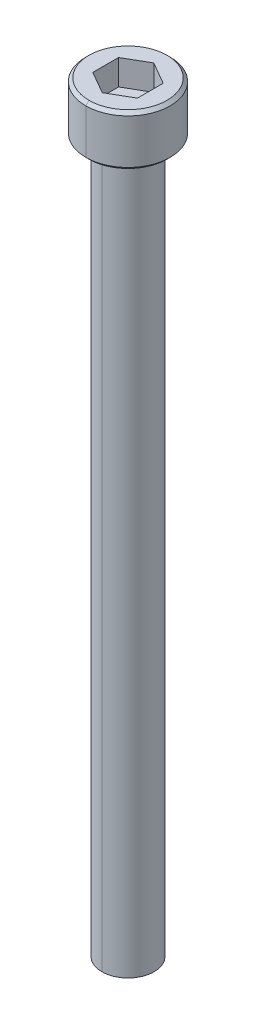
ISO-10303-21;
HEADER;
FILE_DESCRIPTION(('STEP AP214'),'2;1');
FILE_NAME('part.step','',(''),(''),'','','');
FILE_SCHEMA(('AUTOMOTIVE_DESIGN { 1 0 10303 214 1 1 1 1 }'));
ENDSEC;
DATA;
#1=APPLICATION_CONTEXT('core data for automotive mechanical design processes');
#2=APPLICATION_PROTOCOL_DEFINITION('international standard','automotive_design',2000,#1);
#3=PRODUCT_CONTEXT('',#1,'mechanical');
#4=PRODUCT('Part','Part','',(#3));
#5=PRODUCT_RELATED_PRODUCT_CATEGORY('part','',(#4));
#6=PRODUCT_DEFINITION_FORMATION('','',#4);
#7=PRODUCT_DEFINITION_CONTEXT('part definition',#1,'design');
#8=PRODUCT_DEFINITION('design','',#6,#7);
#9=PRODUCT_DEFINITION_SHAPE('','',#8);
#10=(LENGTH_UNIT() NAMED_UNIT(*) SI_UNIT(.MILLI.,.METRE.));
#11=(NAMED_UNIT(*) PLANE_ANGLE_UNIT() SI_UNIT($,.RADIAN.));
#12=(NAMED_UNIT(*) SI_UNIT($,.STERADIAN.) SOLID_ANGLE_UNIT());
#13=UNCERTAINTY_MEASURE_WITH_UNIT(LENGTH_MEASURE(1.E-05),#10,'distance_accuracy_value','');
#14=(GEOMETRIC_REPRESENTATION_CONTEXT(3) GLOBAL_UNCERTAINTY_ASSIGNED_CONTEXT((#13)) GLOBAL_UNIT_ASSIGNED_CONTEXT((#10,
#11,#12)) REPRESENTATION_CONTEXT('',''));
#15=CARTESIAN_POINT('',(0.,0.,0.));
#16=DIRECTION('',(0.,0.,1.));
#17=DIRECTION('',(1.,0.,0.));
#18=AXIS2_PLACEMENT_3D('',#15,#16,#17);
#19=CARTESIAN_POINT('',(0.,-56.61152,0.));
#20=DIRECTION('',(0.,1.,0.));
#21=DIRECTION('',(0.,0.,1.));
#22=AXIS2_PLACEMENT_3D('',#19,#20,#21);
#23=CONICAL_SURFACE('',#22,2.0828,0.960291895410483);
#24=DIRECTION('',(0.,0.573280843383967,-0.819358941251615));
#25=VECTOR('',#24,1.);
#26=CARTESIAN_POINT('',(0.,-56.61152,-2.0828));
#27=LINE('',#26,#25);
#28=CARTESIAN_POINT('',(0.,-57.15,-1.31318));
#29=VERTEX_POINT('',#28);
#30=CARTESIAN_POINT('',(0.,-56.61152,-2.0828));
#31=VERTEX_POINT('',#30);
#32=EDGE_CURVE('E189',#29,#31,#27,.T.);
#33=ORIENTED_EDGE('',*,*,#32,.F.);
#34=CARTESIAN_POINT('',(0.,-57.15,0.));
#35=DIRECTION('',(0.,-1.,0.));
#36=DIRECTION('',(0.,0.,1.));
#37=AXIS2_PLACEMENT_3D('',#34,#35,#36);
#38=CIRCLE('',#37,1.31318);
#39=CARTESIAN_POINT('',(0.,-57.15,1.31318));
#40=VERTEX_POINT('',#39);
#41=EDGE_CURVE('E207',#40,#29,#38,.T.);
#42=ORIENTED_EDGE('',*,*,#41,.F.);
#43=DIRECTION('',(0.,0.573280843383967,0.819358941251615));
#44=VECTOR('',#43,1.);
#45=CARTESIAN_POINT('',(0.,-56.61152,2.0828));
#46=LINE('',#45,#44);
#47=CARTESIAN_POINT('',(0.,-56.61152,2.0828));
#48=VERTEX_POINT('',#47);
#49=EDGE_CURVE('E188',#40,#48,#46,.T.);
#50=ORIENTED_EDGE('',*,*,#49,.T.);
#51=CARTESIAN_POINT('',(0.,-56.61152,0.));
#52=DIRECTION('',(0.,1.,0.));
#53=DIRECTION('',(0.,0.,1.));
#54=AXIS2_PLACEMENT_3D('',#51,#52,#53);
#55=CIRCLE('',#54,2.0828);
#56=EDGE_CURVE('E158',#31,#48,#55,.T.);
#57=ORIENTED_EDGE('',*,*,#56,.F.);
#58=EDGE_LOOP('',(#33,#42,#50,#57));
#59=FACE_BOUND('',#58,.T.);
#60=ADVANCED_FACE('F16',(#59),#23,.T.);
#61=CARTESIAN_POINT('',(0.,0.254,0.));
#62=DIRECTION('',(0.,1.,0.));
#63=DIRECTION('',(0.,0.,1.));
#64=AXIS2_PLACEMENT_3D('',#61,#62,#63);
#65=CONICAL_SURFACE('',#64,3.3655,0.785398163397444);
#66=DIRECTION('',(0.,0.707106781186551,-0.707106781186545));
#67=VECTOR('',#66,1.);
#68=CARTESIAN_POINT('',(0.,0.254,-3.3655));
#69=LINE('',#68,#67);
#70=CARTESIAN_POINT('',(0.,0.,-3.1115));
#71=VERTEX_POINT('',#70);
#72=CARTESIAN_POINT('',(0.,0.254,-3.3655));
#73=VERTEX_POINT('',#72);
#74=EDGE_CURVE('E221',#71,#73,#69,.T.);
#75=ORIENTED_EDGE('',*,*,#74,.F.);
#76=CARTESIAN_POINT('',(0.,0.,0.));
#77=DIRECTION('',(0.,-1.,0.));
#78=DIRECTION('',(0.,0.,1.));
#79=AXIS2_PLACEMENT_3D('',#76,#77,#78);
#80=CIRCLE('',#79,3.1115);
#81=CARTESIAN_POINT('',(0.,0.,3.1115));
#82=VERTEX_POINT('',#81);
#83=EDGE_CURVE('E149',#82,#71,#80,.T.);
#84=ORIENTED_EDGE('',*,*,#83,.F.);
#85=DIRECTION('',(0.,0.707106781186551,0.707106781186545));
#86=VECTOR('',#85,1.);
#87=CARTESIAN_POINT('',(0.,0.254,3.3655));
#88=LINE('',#87,#86);
#89=CARTESIAN_POINT('',(0.,0.254,3.3655));
#90=VERTEX_POINT('',#89);
#91=EDGE_CURVE('E168',#82,#90,#88,.T.);
#92=ORIENTED_EDGE('',*,*,#91,.T.);
#93=CARTESIAN_POINT('',(0.,0.254,0.));
#94=DIRECTION('',(0.,1.,0.));
#95=DIRECTION('',(0.,0.,1.));
#96=AXIS2_PLACEMENT_3D('',#93,#94,#95);
#97=CIRCLE('',#96,3.3655);
#98=EDGE_CURVE('E167',#73,#90,#97,.T.);
#99=ORIENTED_EDGE('',*,*,#98,.F.);
#100=EDGE_LOOP('',(#75,#84,#92,#99));
#101=FACE_BOUND('',#100,.T.);
#102=ADVANCED_FACE('F324',(#101),#65,.T.);
#103=CARTESIAN_POINT('',(0.,4.064,0.));
#104=DIRECTION('',(0.,-1.,0.));
#105=DIRECTION('',(0.,0.,-1.));
#106=AXIS2_PLACEMENT_3D('',#103,#104,#105);
#107=CONICAL_SURFACE('',#106,3.1115,0.785398163397439);
#108=DIRECTION('',(0.,-0.707106781186554,0.707106781186541));
#109=VECTOR('',#108,1.);
#110=CARTESIAN_POINT('',(0.,4.064,3.1115));
#111=LINE('',#110,#109);
#112=CARTESIAN_POINT('',(0.,4.064,3.1115));
#113=VERTEX_POINT('',#112);
#114=CARTESIAN_POINT('',(0.,3.81,3.3655));
#115=VERTEX_POINT('',#114);
#116=EDGE_CURVE('E177',#113,#115,#111,.T.);
#117=ORIENTED_EDGE('',*,*,#116,.F.);
#118=CARTESIAN_POINT('',(0.,4.064,0.));
#119=DIRECTION('',(0.,1.,0.));
#120=DIRECTION('',(0.,0.,1.));
#121=AXIS2_PLACEMENT_3D('',#118,#119,#120);
#122=CIRCLE('',#121,3.1115);
#123=CARTESIAN_POINT('',(0.,4.064,-3.1115));
#124=VERTEX_POINT('',#123);
#125=EDGE_CURVE('E163',#124,#113,#122,.T.);
#126=ORIENTED_EDGE('',*,*,#125,.F.);
#127=DIRECTION('',(0.,-0.707106781186554,-0.707106781186541));
#128=VECTOR('',#127,1.);
#129=CARTESIAN_POINT('',(0.,4.064,-3.1115));
#130=LINE('',#129,#128);
#131=CARTESIAN_POINT('',(0.,3.81,-3.3655));
#132=VERTEX_POINT('',#131);
#133=EDGE_CURVE('E190',#124,#132,#130,.T.);
#134=ORIENTED_EDGE('',*,*,#133,.T.);
#135=CARTESIAN_POINT('',(0.,3.81,0.));
#136=DIRECTION('',(0.,-1.,0.));
#137=DIRECTION('',(0.,0.,1.));
#138=AXIS2_PLACEMENT_3D('',#135,#136,#137);
#139=CIRCLE('',#138,3.3655);
#140=EDGE_CURVE('E153',#115,#132,#139,.T.);
#141=ORIENTED_EDGE('',*,*,#140,.F.);
#142=EDGE_LOOP('',(#117,#126,#134,#141));
#143=FACE_BOUND('',#142,.T.);
#144=ADVANCED_FACE('F348',(#143),#107,.T.);
#145=CARTESIAN_POINT('',(1.778,2.032,3.07958633585746));
#146=DIRECTION('',(0.,1.,0.));
#147=DIRECTION('',(1.,0.,0.));
#148=AXIS2_PLACEMENT_3D('',#145,#146,#147);
#149=PLANE('',#148);
#150=DIRECTION('',(0.866025403784439,0.,0.5));
#151=VECTOR('',#150,1.);
#152=CARTESIAN_POINT('',(-1.778,2.032,1.02652877861915));
#153=LINE('',#152,#151);
#154=CARTESIAN_POINT('',(-1.778,2.032,1.02652877861915));
#155=VERTEX_POINT('',#154);
#156=CARTESIAN_POINT('',(0.,2.032,2.05305755723831));
#157=VERTEX_POINT('',#156);
#158=EDGE_CURVE('E122',#155,#157,#153,.T.);
#159=ORIENTED_EDGE('',*,*,#158,.T.);
#160=DIRECTION('',(0.866025403784439,0.,-0.5));
#161=VECTOR('',#160,1.);
#162=CARTESIAN_POINT('',(0.,2.032,2.05305755723831));
#163=LINE('',#162,#161);
#164=CARTESIAN_POINT('',(1.778,2.032,1.02652877861915));
#165=VERTEX_POINT('',#164);
#166=EDGE_CURVE('E11',#157,#165,#163,.T.);
#167=ORIENTED_EDGE('',*,*,#166,.T.);
#168=DIRECTION('',(0.,0.,-1.));
#169=VECTOR('',#168,1.);
#170=CARTESIAN_POINT('',(1.778,2.032,1.02652877861915));
#171=LINE('',#170,#169);
#172=CARTESIAN_POINT('',(1.778,2.032,-1.02652877861915));
#173=VERTEX_POINT('',#172);
#174=EDGE_CURVE('E214',#165,#173,#171,.T.);
#175=ORIENTED_EDGE('',*,*,#174,.T.);
#176=DIRECTION('',(-0.866025403784439,0.,-0.5));
#177=VECTOR('',#176,1.);
#178=CARTESIAN_POINT('',(1.778,2.032,-1.02652877861915));
#179=LINE('',#178,#177);
#180=CARTESIAN_POINT('',(0.,2.032,-2.05305755723831));
#181=VERTEX_POINT('',#180);
#182=EDGE_CURVE('E201',#173,#181,#179,.T.);
#183=ORIENTED_EDGE('',*,*,#182,.T.);
#184=DIRECTION('',(-0.866025403784439,0.,0.5));
#185=VECTOR('',#184,1.);
#186=CARTESIAN_POINT('',(0.,2.032,-2.05305755723831));
#187=LINE('',#186,#185);
#188=CARTESIAN_POINT('',(-1.778,2.032,-1.02652877861915));
#189=VERTEX_POINT('',#188);
#190=EDGE_CURVE('E126',#181,#189,#187,.T.);
#191=ORIENTED_EDGE('',*,*,#190,.T.);
#192=DIRECTION('',(0.,0.,1.));
#193=VECTOR('',#192,1.);
#194=CARTESIAN_POINT('',(-1.778,2.032,-1.02652877861915));
#195=LINE('',#194,#193);
#196=EDGE_CURVE('E118',#189,#155,#195,.T.);
#197=ORIENTED_EDGE('',*,*,#196,.T.);
#198=EDGE_LOOP('',(#159,#167,#175,#183,#191,#197));
#199=FACE_BOUND('',#198,.T.);
#200=ADVANCED_FACE('F120',(#199),#149,.T.);
#201=CARTESIAN_POINT('',(0.,2.032,2.05305755723831));
#202=DIRECTION('',(0.5,0.,0.866025403784439));
#203=DIRECTION('',(0.,-1.,0.));
#204=AXIS2_PLACEMENT_3D('',#201,#202,#203);
#205=PLANE('',#204);
#206=DIRECTION('',(0.866025403784439,0.,-0.5));
#207=VECTOR('',#206,1.);
#208=CARTESIAN_POINT('',(0.,4.064,2.05305755723831));
#209=LINE('',#208,#207);
#210=CARTESIAN_POINT('',(0.,4.064,2.05305755723831));
#211=VERTEX_POINT('',#210);
#212=CARTESIAN_POINT('',(1.778,4.064,1.02652877861915));
#213=VERTEX_POINT('',#212);
#214=EDGE_CURVE('E182',#211,#213,#209,.T.);
#215=ORIENTED_EDGE('',*,*,#214,.T.);
#216=DIRECTION('',(0.,1.,0.));
#217=VECTOR('',#216,1.);
#218=CARTESIAN_POINT('',(1.778,2.032,1.02652877861915));
#219=LINE('',#218,#217);
#220=EDGE_CURVE('E27',#165,#213,#219,.T.);
#221=ORIENTED_EDGE('',*,*,#220,.F.);
#222=ORIENTED_EDGE('',*,*,#166,.F.);
#223=DIRECTION('',(0.,1.,0.));
#224=VECTOR('',#223,1.);
#225=CARTESIAN_POINT('',(0.,2.032,2.05305755723831));
#226=LINE('',#225,#224);
#227=EDGE_CURVE('E142',#157,#211,#226,.T.);
#228=ORIENTED_EDGE('',*,*,#227,.T.);
#229=EDGE_LOOP('',(#215,#221,#222,#228));
#230=FACE_BOUND('',#229,.T.);
#231=ADVANCED_FACE('F481',(#230),#205,.F.);
#232=CARTESIAN_POINT('',(1.778,2.032,1.02652877861915));
#233=DIRECTION('',(1.,0.,0.));
#234=DIRECTION('',(0.,0.,-1.));
#235=AXIS2_PLACEMENT_3D('',#232,#233,#234);
#236=PLANE('',#235);
#237=DIRECTION('',(0.,0.,-1.));
#238=VECTOR('',#237,1.);
#239=CARTESIAN_POINT('',(1.778,4.064,1.02652877861915));
#240=LINE('',#239,#238);
#241=CARTESIAN_POINT('',(1.778,4.064,-1.02652877861915));
#242=VERTEX_POINT('',#241);
#243=EDGE_CURVE('E178',#213,#242,#240,.T.);
#244=ORIENTED_EDGE('',*,*,#243,.T.);
#245=DIRECTION('',(0.,1.,0.));
#246=VECTOR('',#245,1.);
#247=CARTESIAN_POINT('',(1.778,2.032,-1.02652877861915));
#248=LINE('',#247,#246);
#249=EDGE_CURVE('E204',#173,#242,#248,.T.);
#250=ORIENTED_EDGE('',*,*,#249,.F.);
#251=ORIENTED_EDGE('',*,*,#174,.F.);
#252=ORIENTED_EDGE('',*,*,#220,.T.);
#253=EDGE_LOOP('',(#244,#250,#251,#252));
#254=FACE_BOUND('',#253,.T.);
#255=ADVANCED_FACE('F465',(#254),#236,.F.);
#256=CARTESIAN_POINT('',(1.778,2.032,-1.02652877861915));
#257=DIRECTION('',(0.5,0.,-0.866025403784439));
#258=DIRECTION('',(0.,-1.,0.));
#259=AXIS2_PLACEMENT_3D('',#256,#257,#258);
#260=PLANE('',#259);
#261=DIRECTION('',(-0.866025403784439,0.,-0.5));
#262=VECTOR('',#261,1.);
#263=CARTESIAN_POINT('',(1.778,4.064,-1.02652877861915));
#264=LINE('',#263,#262);
#265=CARTESIAN_POINT('',(0.,4.064,-2.05305755723831));
#266=VERTEX_POINT('',#265);
#267=EDGE_CURVE('E183',#242,#266,#264,.T.);
#268=ORIENTED_EDGE('',*,*,#267,.T.);
#269=DIRECTION('',(0.,1.,0.));
#270=VECTOR('',#269,1.);
#271=CARTESIAN_POINT('',(0.,2.032,-2.05305755723831));
#272=LINE('',#271,#270);
#273=EDGE_CURVE('E162',#181,#266,#272,.T.);
#274=ORIENTED_EDGE('',*,*,#273,.F.);
#275=ORIENTED_EDGE('',*,*,#182,.F.);
#276=ORIENTED_EDGE('',*,*,#249,.T.);
#277=EDGE_LOOP('',(#268,#274,#275,#276));
#278=FACE_BOUND('',#277,.T.);
#279=ADVANCED_FACE('F461',(#278),#260,.F.);
#280=CARTESIAN_POINT('',(0.,2.032,-2.05305755723831));
#281=DIRECTION('',(-0.5,0.,-0.866025403784439));
#282=DIRECTION('',(-0.866025403784439,0.,0.5));
#283=AXIS2_PLACEMENT_3D('',#280,#281,#282);
#284=PLANE('',#283);
#285=DIRECTION('',(-0.866025403784439,0.,0.5));
#286=VECTOR('',#285,1.);
#287=CARTESIAN_POINT('',(0.,4.064,-2.05305755723831));
#288=LINE('',#287,#286);
#289=CARTESIAN_POINT('',(-1.778,4.064,-1.02652877861915));
#290=VERTEX_POINT('',#289);
#291=EDGE_CURVE('E224',#266,#290,#288,.T.);
#292=ORIENTED_EDGE('',*,*,#291,.T.);
#293=DIRECTION('',(0.,1.,0.));
#294=VECTOR('',#293,1.);
#295=CARTESIAN_POINT('',(-1.778,2.032,-1.02652877861915));
#296=LINE('',#295,#294);
#297=EDGE_CURVE('E131',#189,#290,#296,.T.);
#298=ORIENTED_EDGE('',*,*,#297,.F.);
#299=ORIENTED_EDGE('',*,*,#190,.F.);
#300=ORIENTED_EDGE('',*,*,#273,.T.);
#301=EDGE_LOOP('',(#292,#298,#299,#300));
#302=FACE_BOUND('',#301,.T.);
#303=ADVANCED_FACE('F278',(#302),#284,.F.);
#304=CARTESIAN_POINT('',(-1.778,2.032,-1.02652877861915));
#305=DIRECTION('',(-1.,0.,0.));
#306=DIRECTION('',(0.,1.,0.));
#307=AXIS2_PLACEMENT_3D('',#304,#305,#306);
#308=PLANE('',#307);
#309=DIRECTION('',(0.,0.,1.));
#310=VECTOR('',#309,1.);
#311=CARTESIAN_POINT('',(-1.778,4.064,-1.02652877861915));
#312=LINE('',#311,#310);
#313=CARTESIAN_POINT('',(-1.778,4.064,1.02652877861915));
#314=VERTEX_POINT('',#313);
#315=EDGE_CURVE('E136',#290,#314,#312,.T.);
#316=ORIENTED_EDGE('',*,*,#315,.T.);
#317=DIRECTION('',(0.,1.,0.));
#318=VECTOR('',#317,1.);
#319=CARTESIAN_POINT('',(-1.778,2.032,1.02652877861915));
#320=LINE('',#319,#318);
#321=EDGE_CURVE('E20',#155,#314,#320,.T.);
#322=ORIENTED_EDGE('',*,*,#321,.F.);
#323=ORIENTED_EDGE('',*,*,#196,.F.);
#324=ORIENTED_EDGE('',*,*,#297,.T.);
#325=EDGE_LOOP('',(#316,#322,#323,#324));
#326=FACE_BOUND('',#325,.T.);
#327=ADVANCED_FACE('F134',(#326),#308,.F.);
#328=CARTESIAN_POINT('',(-1.778,2.032,1.02652877861915));
#329=DIRECTION('',(-0.5,0.,0.866025403784439));
#330=DIRECTION('',(0.,1.,0.));
#331=AXIS2_PLACEMENT_3D('',#328,#329,#330);
#332=PLANE('',#331);
#333=DIRECTION('',(0.866025403784439,0.,0.5));
#334=VECTOR('',#333,1.);
#335=CARTESIAN_POINT('',(-1.778,4.064,1.02652877861915));
#336=LINE('',#335,#334);
#337=EDGE_CURVE('E166',#314,#211,#336,.T.);
#338=ORIENTED_EDGE('',*,*,#337,.T.);
#339=ORIENTED_EDGE('',*,*,#227,.F.);
#340=ORIENTED_EDGE('',*,*,#158,.F.);
#341=ORIENTED_EDGE('',*,*,#321,.T.);
#342=EDGE_LOOP('',(#338,#339,#340,#341));
#343=FACE_BOUND('',#342,.T.);
#344=ADVANCED_FACE('F141',(#343),#332,.F.);
#345=CARTESIAN_POINT('',(0.,0.,0.));
#346=DIRECTION('',(0.,1.,0.));
#347=DIRECTION('',(1.,0.,0.));
#348=AXIS2_PLACEMENT_3D('',#345,#346,#347);
#349=PLANE('',#348);
#350=CARTESIAN_POINT('',(0.,0.,0.));
#351=DIRECTION('',(0.,1.,0.));
#352=DIRECTION('',(0.,0.,1.));
#353=AXIS2_PLACEMENT_3D('',#350,#351,#352);
#354=CIRCLE('',#353,2.0828);
#355=CARTESIAN_POINT('',(0.,0.,2.0828));
#356=VERTEX_POINT('',#355);
#357=CARTESIAN_POINT('',(0.,0.,-2.0828));
#358=VERTEX_POINT('',#357);
#359=EDGE_CURVE('E159',#356,#358,#354,.T.);
#360=ORIENTED_EDGE('',*,*,#359,.T.);
#361=CARTESIAN_POINT('',(0.,0.,0.));
#362=DIRECTION('',(0.,1.,0.));
#363=DIRECTION('',(0.,0.,1.));
#364=AXIS2_PLACEMENT_3D('',#361,#362,#363);
#365=CIRCLE('',#364,2.0828);
#366=EDGE_CURVE('E211',#358,#356,#365,.T.);
#367=ORIENTED_EDGE('',*,*,#366,.T.);
#368=EDGE_LOOP('',(#360,#367));
#369=FACE_BOUND('',#368,.T.);
#370=ORIENTED_EDGE('',*,*,#83,.T.);
#371=CARTESIAN_POINT('',(0.,0.,0.));
#372=DIRECTION('',(0.,-1.,0.));
#373=DIRECTION('',(0.,0.,1.));
#374=AXIS2_PLACEMENT_3D('',#371,#372,#373);
#375=CIRCLE('',#374,3.1115);
#376=EDGE_CURVE('E243',#71,#82,#375,.T.);
#377=ORIENTED_EDGE('',*,*,#376,.T.);
#378=EDGE_LOOP('',(#370,#377));
#379=FACE_BOUND('',#378,.T.);
#380=ADVANCED_FACE('F314',(#369,#379),#349,.F.);
#381=CARTESIAN_POINT('',(0.,4.064,0.));
#382=DIRECTION('',(0.,1.,0.));
#383=DIRECTION('',(1.,0.,0.));
#384=AXIS2_PLACEMENT_3D('',#381,#382,#383);
#385=PLANE('',#384);
#386=ORIENTED_EDGE('',*,*,#337,.F.);
#387=ORIENTED_EDGE('',*,*,#315,.F.);
#388=ORIENTED_EDGE('',*,*,#291,.F.);
#389=ORIENTED_EDGE('',*,*,#267,.F.);
#390=ORIENTED_EDGE('',*,*,#243,.F.);
#391=ORIENTED_EDGE('',*,*,#214,.F.);
#392=EDGE_LOOP('',(#386,#387,#388,#389,#390,#391));
#393=FACE_BOUND('',#392,.T.);
#394=ORIENTED_EDGE('',*,*,#125,.T.);
#395=CARTESIAN_POINT('',(0.,4.064,0.));
#396=DIRECTION('',(0.,1.,0.));
#397=DIRECTION('',(0.,0.,1.));
#398=AXIS2_PLACEMENT_3D('',#395,#396,#397);
#399=CIRCLE('',#398,3.1115);
#400=EDGE_CURVE('E172',#113,#124,#399,.T.);
#401=ORIENTED_EDGE('',*,*,#400,.T.);
#402=EDGE_LOOP('',(#394,#401));
#403=FACE_BOUND('',#402,.T.);
#404=ADVANCED_FACE('F283',(#393,#403),#385,.T.);
#405=CARTESIAN_POINT('',(0.,4.064,0.));
#406=DIRECTION('',(0.,-1.,0.));
#407=DIRECTION('',(0.,0.,-1.));
#408=AXIS2_PLACEMENT_3D('',#405,#406,#407);
#409=CYLINDRICAL_SURFACE('',#408,3.3655);
#410=DIRECTION('',(0.,-1.,0.));
#411=VECTOR('',#410,1.);
#412=CARTESIAN_POINT('',(0.,4.064,3.3655));
#413=LINE('',#412,#411);
#414=EDGE_CURVE('E194',#115,#90,#413,.T.);
#415=ORIENTED_EDGE('',*,*,#414,.F.);
#416=ORIENTED_EDGE('',*,*,#140,.T.);
#417=DIRECTION('',(0.,-1.,0.));
#418=VECTOR('',#417,1.);
#419=CARTESIAN_POINT('',(0.,4.064,-3.3655));
#420=LINE('',#419,#418);
#421=EDGE_CURVE('E196',#132,#73,#420,.T.);
#422=ORIENTED_EDGE('',*,*,#421,.T.);
#423=ORIENTED_EDGE('',*,*,#98,.T.);
#424=EDGE_LOOP('',(#415,#416,#422,#423));
#425=FACE_BOUND('',#424,.T.);
#426=ADVANCED_FACE('F333',(#425),#409,.T.);
#427=CARTESIAN_POINT('',(0.,-57.15,0.));
#428=DIRECTION('',(0.,1.,0.));
#429=DIRECTION('',(1.,0.,0.));
#430=AXIS2_PLACEMENT_3D('',#427,#428,#429);
#431=PLANE('',#430);
#432=ORIENTED_EDGE('',*,*,#41,.T.);
#433=CARTESIAN_POINT('',(0.,-57.15,0.));
#434=DIRECTION('',(0.,-1.,0.));
#435=DIRECTION('',(0.,0.,1.));
#436=AXIS2_PLACEMENT_3D('',#433,#434,#435);
#437=CIRCLE('',#436,1.31318);
#438=EDGE_CURVE('E246',#29,#40,#437,.T.);
#439=ORIENTED_EDGE('',*,*,#438,.T.);
#440=EDGE_LOOP('',(#432,#439));
#441=FACE_BOUND('',#440,.T.);
#442=ADVANCED_FACE('F504',(#441),#431,.F.);
#443=CARTESIAN_POINT('',(0.,-57.15,0.));
#444=DIRECTION('',(0.,1.,0.));
#445=DIRECTION('',(0.,0.,1.));
#446=AXIS2_PLACEMENT_3D('',#443,#444,#445);
#447=CYLINDRICAL_SURFACE('',#446,2.0828);
#448=DIRECTION('',(0.,1.,0.));
#449=VECTOR('',#448,1.);
#450=CARTESIAN_POINT('',(0.,-57.15,-2.0828));
#451=LINE('',#450,#449);
#452=EDGE_CURVE('E199',#31,#358,#451,.T.);
#453=ORIENTED_EDGE('',*,*,#452,.F.);
#454=ORIENTED_EDGE('',*,*,#56,.T.);
#455=DIRECTION('',(0.,1.,0.));
#456=VECTOR('',#455,1.);
#457=CARTESIAN_POINT('',(0.,-57.15,2.0828));
#458=LINE('',#457,#456);
#459=EDGE_CURVE('E154',#48,#356,#458,.T.);
#460=ORIENTED_EDGE('',*,*,#459,.T.);
#461=ORIENTED_EDGE('',*,*,#366,.F.);
#462=EDGE_LOOP('',(#453,#454,#460,#461));
#463=FACE_BOUND('',#462,.T.);
#464=ADVANCED_FACE('F312',(#463),#447,.T.);
#465=CARTESIAN_POINT('',(0.,-57.15,0.));
#466=DIRECTION('',(0.,1.,0.));
#467=DIRECTION('',(0.,0.,1.));
#468=AXIS2_PLACEMENT_3D('',#465,#466,#467);
#469=CYLINDRICAL_SURFACE('',#468,2.0828);
#470=CARTESIAN_POINT('',(0.,-56.61152,0.));
#471=DIRECTION('',(0.,1.,0.));
#472=DIRECTION('',(0.,0.,1.));
#473=AXIS2_PLACEMENT_3D('',#470,#471,#472);
#474=CIRCLE('',#473,2.0828);
#475=EDGE_CURVE('E184',#48,#31,#474,.T.);
#476=ORIENTED_EDGE('',*,*,#475,.T.);
#477=ORIENTED_EDGE('',*,*,#452,.T.);
#478=ORIENTED_EDGE('',*,*,#359,.F.);
#479=ORIENTED_EDGE('',*,*,#459,.F.);
#480=EDGE_LOOP('',(#476,#477,#478,#479));
#481=FACE_BOUND('',#480,.T.);
#482=ADVANCED_FACE('F18',(#481),#469,.T.);
#483=CARTESIAN_POINT('',(0.,4.064,0.));
#484=DIRECTION('',(0.,-1.,0.));
#485=DIRECTION('',(0.,0.,-1.));
#486=AXIS2_PLACEMENT_3D('',#483,#484,#485);
#487=CYLINDRICAL_SURFACE('',#486,3.3655);
#488=CARTESIAN_POINT('',(0.,3.81,0.));
#489=DIRECTION('',(0.,-1.,0.));
#490=DIRECTION('',(0.,0.,1.));
#491=AXIS2_PLACEMENT_3D('',#488,#489,#490);
#492=CIRCLE('',#491,3.3655);
#493=EDGE_CURVE('E195',#132,#115,#492,.T.);
#494=ORIENTED_EDGE('',*,*,#493,.T.);
#495=ORIENTED_EDGE('',*,*,#414,.T.);
#496=CARTESIAN_POINT('',(0.,0.254,0.));
#497=DIRECTION('',(0.,1.,0.));
#498=DIRECTION('',(0.,0.,1.));
#499=AXIS2_PLACEMENT_3D('',#496,#497,#498);
#500=CIRCLE('',#499,3.3655);
#501=EDGE_CURVE('E173',#90,#73,#500,.T.);
#502=ORIENTED_EDGE('',*,*,#501,.T.);
#503=ORIENTED_EDGE('',*,*,#421,.F.);
#504=EDGE_LOOP('',(#494,#495,#502,#503));
#505=FACE_BOUND('',#504,.T.);
#506=ADVANCED_FACE('F337',(#505),#487,.T.);
#507=CARTESIAN_POINT('',(0.,4.064,0.));
#508=DIRECTION('',(0.,-1.,0.));
#509=DIRECTION('',(0.,0.,-1.));
#510=AXIS2_PLACEMENT_3D('',#507,#508,#509);
#511=CONICAL_SURFACE('',#510,3.1115,0.785398163397439);
#512=ORIENTED_EDGE('',*,*,#400,.F.);
#513=ORIENTED_EDGE('',*,*,#116,.T.);
#514=ORIENTED_EDGE('',*,*,#493,.F.);
#515=ORIENTED_EDGE('',*,*,#133,.F.);
#516=EDGE_LOOP('',(#512,#513,#514,#515));
#517=FACE_BOUND('',#516,.T.);
#518=ADVANCED_FACE('F346',(#517),#511,.T.);
#519=CARTESIAN_POINT('',(0.,0.254,0.));
#520=DIRECTION('',(0.,1.,0.));
#521=DIRECTION('',(0.,0.,1.));
#522=AXIS2_PLACEMENT_3D('',#519,#520,#521);
#523=CONICAL_SURFACE('',#522,3.3655,0.785398163397444);
#524=ORIENTED_EDGE('',*,*,#376,.F.);
#525=ORIENTED_EDGE('',*,*,#74,.T.);
#526=ORIENTED_EDGE('',*,*,#501,.F.);
#527=ORIENTED_EDGE('',*,*,#91,.F.);
#528=EDGE_LOOP('',(#524,#525,#526,#527));
#529=FACE_BOUND('',#528,.T.);
#530=ADVANCED_FACE('F327',(#529),#523,.T.);
#531=CARTESIAN_POINT('',(0.,-56.61152,0.));
#532=DIRECTION('',(0.,1.,0.));
#533=DIRECTION('',(0.,0.,1.));
#534=AXIS2_PLACEMENT_3D('',#531,#532,#533);
#535=CONICAL_SURFACE('',#534,2.0828,0.960291895410483);
#536=ORIENTED_EDGE('',*,*,#438,.F.);
#537=ORIENTED_EDGE('',*,*,#32,.T.);
#538=ORIENTED_EDGE('',*,*,#475,.F.);
#539=ORIENTED_EDGE('',*,*,#49,.F.);
#540=EDGE_LOOP('',(#536,#537,#538,#539));
#541=FACE_BOUND('',#540,.T.);
#542=ADVANCED_FACE('F307',(#541),#535,.T.);
#543=CLOSED_SHELL('',(#60,#102,#144,#200,#231,#255,#279,#303,#327,#344,#380,#404,#426,#442,#464,
#482,#506,#518,#530,#542));
#544=MANIFOLD_SOLID_BREP('B1',#543);
#545=ADVANCED_BREP_SHAPE_REPRESENTATION('',(#18,#544),#14);
#546=SHAPE_DEFINITION_REPRESENTATION(#9,#545);
ENDSEC;
END-ISO-10303-21;
